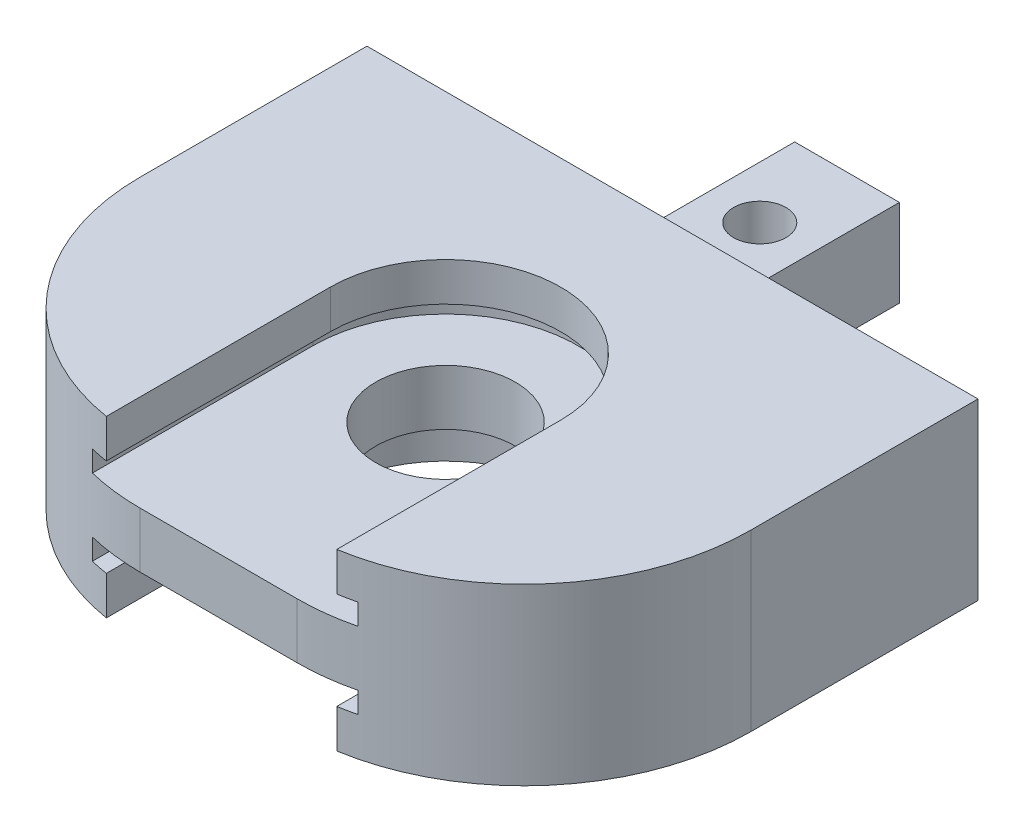
ISO-10303-21;
HEADER;
FILE_DESCRIPTION(('STEP AP214'),'2;1');
FILE_NAME('part.step','',(''),(''),'','','');
FILE_SCHEMA(('AUTOMOTIVE_DESIGN { 1 0 10303 214 1 1 1 1 }'));
ENDSEC;
DATA;
#1=APPLICATION_CONTEXT('core data for automotive mechanical design processes');
#2=APPLICATION_PROTOCOL_DEFINITION('international standard','automotive_design',2000,#1);
#3=PRODUCT_CONTEXT('',#1,'mechanical');
#4=PRODUCT('Part','Part','',(#3));
#5=PRODUCT_RELATED_PRODUCT_CATEGORY('part','',(#4));
#6=PRODUCT_DEFINITION_FORMATION('','',#4);
#7=PRODUCT_DEFINITION_CONTEXT('part definition',#1,'design');
#8=PRODUCT_DEFINITION('design','',#6,#7);
#9=PRODUCT_DEFINITION_SHAPE('','',#8);
#10=(LENGTH_UNIT() NAMED_UNIT(*) SI_UNIT(.MILLI.,.METRE.));
#11=(NAMED_UNIT(*) PLANE_ANGLE_UNIT() SI_UNIT($,.RADIAN.));
#12=(NAMED_UNIT(*) SI_UNIT($,.STERADIAN.) SOLID_ANGLE_UNIT());
#13=UNCERTAINTY_MEASURE_WITH_UNIT(LENGTH_MEASURE(1.E-05),#10,'distance_accuracy_value','');
#14=(GEOMETRIC_REPRESENTATION_CONTEXT(3) GLOBAL_UNCERTAINTY_ASSIGNED_CONTEXT((#13)) GLOBAL_UNIT_ASSIGNED_CONTEXT((#10,
#11,#12)) REPRESENTATION_CONTEXT('',''));
#15=CARTESIAN_POINT('',(0.,0.,0.));
#16=DIRECTION('',(0.,0.,1.));
#17=DIRECTION('',(1.,0.,0.));
#18=AXIS2_PLACEMENT_3D('',#15,#16,#17);
#19=CARTESIAN_POINT('',(33.,5.,36.));
#20=DIRECTION('',(0.,0.,-1.));
#21=DIRECTION('',(-1.,0.,0.));
#22=AXIS2_PLACEMENT_3D('',#19,#20,#21);
#23=PLANE('',#22);
#24=DIRECTION('',(0.,-1.,0.));
#25=VECTOR('',#24,1.);
#26=CARTESIAN_POINT('',(11.,5.,36.));
#27=LINE('',#26,#25);
#28=CARTESIAN_POINT('',(11.,4.0875,36.));
#29=VERTEX_POINT('',#28);
#30=CARTESIAN_POINT('',(11.,0.912499999999999,36.));
#31=VERTEX_POINT('',#30);
#32=EDGE_CURVE('E409',#29,#31,#27,.T.);
#33=ORIENTED_EDGE('',*,*,#32,.T.);
#34=DIRECTION('',(-1.,0.,0.));
#35=VECTOR('',#34,1.);
#36=CARTESIAN_POINT('',(23.1,0.912499999999999,36.));
#37=LINE('',#36,#35);
#38=CARTESIAN_POINT('',(20.,0.912499999999999,36.));
#39=VERTEX_POINT('',#38);
#40=EDGE_CURVE('E242',#39,#31,#37,.T.);
#41=ORIENTED_EDGE('',*,*,#40,.F.);
#42=DIRECTION('',(0.,-1.,0.));
#43=VECTOR('',#42,1.);
#44=CARTESIAN_POINT('',(20.,5.,36.));
#45=LINE('',#44,#43);
#46=CARTESIAN_POINT('',(20.,4.0875,36.));
#47=VERTEX_POINT('',#46);
#48=EDGE_CURVE('E412',#39,#47,#45,.F.);
#49=ORIENTED_EDGE('',*,*,#48,.T.);
#50=DIRECTION('',(-1.,0.,0.));
#51=VECTOR('',#50,1.);
#52=CARTESIAN_POINT('',(15.5,4.0875,36.));
#53=LINE('',#52,#51);
#54=EDGE_CURVE('E284',#47,#29,#53,.T.);
#55=ORIENTED_EDGE('',*,*,#54,.T.);
#56=EDGE_LOOP('',(#33,#41,#49,#55));
#57=FACE_BOUND('',#56,.T.);
#58=ADVANCED_FACE('F41',(#57),#23,.F.);
#59=CARTESIAN_POINT('',(-2.,7.5,-25.0891721190455));
#60=DIRECTION('',(0.,1.,0.));
#61=DIRECTION('',(0.,0.,1.));
#62=AXIS2_PLACEMENT_3D('',#59,#60,#61);
#63=PLANE('',#62);
#64=DIRECTION('',(0.,0.,1.));
#65=VECTOR('',#64,1.);
#66=CARTESIAN_POINT('',(8.9,7.5,23.));
#67=LINE('',#66,#65);
#68=CARTESIAN_POINT('',(8.9,7.5,23.));
#69=VERTEX_POINT('',#68);
#70=CARTESIAN_POINT('',(8.9,7.5,35.8292634239071));
#71=VERTEX_POINT('',#70);
#72=EDGE_CURVE('E57',#69,#71,#67,.T.);
#73=ORIENTED_EDGE('',*,*,#72,.F.);
#74=CARTESIAN_POINT('',(15.5,7.5,23.));
#75=DIRECTION('',(0.,1.,0.));
#76=DIRECTION('',(0.,0.,1.));
#77=AXIS2_PLACEMENT_3D('',#74,#75,#76);
#78=CIRCLE('',#77,6.6);
#79=CARTESIAN_POINT('',(22.1,7.5,23.));
#80=VERTEX_POINT('',#79);
#81=EDGE_CURVE('E271',#80,#69,#78,.T.);
#82=ORIENTED_EDGE('',*,*,#81,.F.);
#83=DIRECTION('',(0.,0.,1.));
#84=VECTOR('',#83,1.);
#85=CARTESIAN_POINT('',(22.1,7.5,23.));
#86=LINE('',#85,#84);
#87=CARTESIAN_POINT('',(22.1,7.5,35.8292634239071));
#88=VERTEX_POINT('',#87);
#89=EDGE_CURVE('E321',#80,#88,#86,.T.);
#90=ORIENTED_EDGE('',*,*,#89,.T.);
#91=CARTESIAN_POINT('',(20.,7.5,23.));
#92=DIRECTION('',(0.,1.,0.));
#93=DIRECTION('',(0.,0.,1.));
#94=AXIS2_PLACEMENT_3D('',#91,#92,#93);
#95=CIRCLE('',#94,13.);
#96=CARTESIAN_POINT('',(33.,7.5,23.));
#97=VERTEX_POINT('',#96);
#98=EDGE_CURVE('E418',#88,#97,#95,.T.);
#99=ORIENTED_EDGE('',*,*,#98,.T.);
#100=DIRECTION('',(0.,0.,1.));
#101=VECTOR('',#100,1.);
#102=CARTESIAN_POINT('',(33.,7.5,-25.0891721190455));
#103=LINE('',#102,#101);
#104=CARTESIAN_POINT('',(33.,7.5,10.));
#105=VERTEX_POINT('',#104);
#106=EDGE_CURVE('E343',#105,#97,#103,.T.);
#107=ORIENTED_EDGE('',*,*,#106,.F.);
#108=DIRECTION('',(1.,0.,0.));
#109=VECTOR('',#108,1.);
#110=CARTESIAN_POINT('',(-2.,7.5,10.));
#111=LINE('',#110,#109);
#112=CARTESIAN_POINT('',(-2.,7.5,10.));
#113=VERTEX_POINT('',#112);
#114=EDGE_CURVE('E344',#113,#105,#111,.T.);
#115=ORIENTED_EDGE('',*,*,#114,.F.);
#116=DIRECTION('',(0.,0.,1.));
#117=VECTOR('',#116,1.);
#118=CARTESIAN_POINT('',(-2.,7.5,-25.0891721190455));
#119=LINE('',#118,#117);
#120=CARTESIAN_POINT('',(-2.,7.5,23.));
#121=VERTEX_POINT('',#120);
#122=EDGE_CURVE('E349',#113,#121,#119,.T.);
#123=ORIENTED_EDGE('',*,*,#122,.T.);
#124=CARTESIAN_POINT('',(11.,7.5,23.));
#125=DIRECTION('',(0.,1.,0.));
#126=DIRECTION('',(0.,0.,1.));
#127=AXIS2_PLACEMENT_3D('',#124,#125,#126);
#128=CIRCLE('',#127,13.);
#129=EDGE_CURVE('E414',#121,#71,#128,.T.);
#130=ORIENTED_EDGE('',*,*,#129,.T.);
#131=EDGE_LOOP('',(#73,#82,#90,#99,#107,#115,#123,#130));
#132=FACE_BOUND('',#131,.T.);
#133=ADVANCED_FACE('F545',(#132),#63,.T.);
#134=CARTESIAN_POINT('',(20.,5.,23.));
#135=DIRECTION('',(0.,-1.,0.));
#136=DIRECTION('',(0.,0.,-1.));
#137=AXIS2_PLACEMENT_3D('',#134,#135,#136);
#138=CYLINDRICAL_SURFACE('',#137,13.);
#139=CARTESIAN_POINT('',(20.,0.912499999999999,23.));
#140=DIRECTION('',(0.,1.,0.));
#141=DIRECTION('',(0.,0.,1.));
#142=AXIS2_PLACEMENT_3D('',#139,#140,#141);
#143=CIRCLE('',#142,13.);
#144=CARTESIAN_POINT('',(23.1,0.912499999999999,35.6249752475005));
#145=VERTEX_POINT('',#144);
#146=EDGE_CURVE('E269',#145,#39,#143,.F.);
#147=ORIENTED_EDGE('',*,*,#146,.F.);
#148=DIRECTION('',(0.,-1.,0.));
#149=VECTOR('',#148,1.);
#150=CARTESIAN_POINT('',(23.1,5.,35.6249752475005));
#151=LINE('',#150,#149);
#152=CARTESIAN_POINT('',(23.1,-0.287500000000004,35.6249752475005));
#153=VERTEX_POINT('',#152);
#154=EDGE_CURVE('E11',#153,#145,#151,.F.);
#155=ORIENTED_EDGE('',*,*,#154,.F.);
#156=CARTESIAN_POINT('',(20.,-0.287499999999993,23.));
#157=DIRECTION('',(0.,-1.,0.));
#158=DIRECTION('',(1.,0.,0.));
#159=AXIS2_PLACEMENT_3D('',#156,#157,#158);
#160=CIRCLE('',#159,13.);
#161=CARTESIAN_POINT('',(22.1,-0.2875,35.8292634239071));
#162=VERTEX_POINT('',#161);
#163=EDGE_CURVE('E50',#162,#153,#160,.F.);
#164=ORIENTED_EDGE('',*,*,#163,.F.);
#165=DIRECTION('',(0.,-1.,0.));
#166=VECTOR('',#165,1.);
#167=CARTESIAN_POINT('',(22.1,5.,35.8292634239071));
#168=LINE('',#167,#166);
#169=CARTESIAN_POINT('',(22.1,-2.5,35.8292634239071));
#170=VERTEX_POINT('',#169);
#171=EDGE_CURVE('E257',#170,#162,#168,.F.);
#172=ORIENTED_EDGE('',*,*,#171,.F.);
#173=CARTESIAN_POINT('',(20.,-2.5,23.));
#174=DIRECTION('',(0.,-1.,0.));
#175=DIRECTION('',(0.,0.,-1.));
#176=AXIS2_PLACEMENT_3D('',#173,#174,#175);
#177=CIRCLE('',#176,13.);
#178=CARTESIAN_POINT('',(33.,-2.5,23.));
#179=VERTEX_POINT('',#178);
#180=EDGE_CURVE('E406',#179,#170,#177,.T.);
#181=ORIENTED_EDGE('',*,*,#180,.F.);
#182=DIRECTION('',(0.,-1.,0.));
#183=VECTOR('',#182,1.);
#184=CARTESIAN_POINT('',(33.,5.,23.));
#185=LINE('',#184,#183);
#186=EDGE_CURVE('E331',#97,#179,#185,.T.);
#187=ORIENTED_EDGE('',*,*,#186,.F.);
#188=ORIENTED_EDGE('',*,*,#98,.F.);
#189=DIRECTION('',(0.,-1.,0.));
#190=VECTOR('',#189,1.);
#191=CARTESIAN_POINT('',(22.1,5.,35.8292634239071));
#192=LINE('',#191,#190);
#193=CARTESIAN_POINT('',(22.1,5.2875,35.8292634239071));
#194=VERTEX_POINT('',#193);
#195=EDGE_CURVE('E439',#88,#194,#192,.T.);
#196=ORIENTED_EDGE('',*,*,#195,.T.);
#197=CARTESIAN_POINT('',(20.,5.28749999999999,23.));
#198=DIRECTION('',(0.,-1.,0.));
#199=DIRECTION('',(1.,0.,0.));
#200=AXIS2_PLACEMENT_3D('',#197,#198,#199);
#201=CIRCLE('',#200,13.);
#202=CARTESIAN_POINT('',(23.1,5.2875,35.6249752475005));
#203=VERTEX_POINT('',#202);
#204=EDGE_CURVE('E436',#194,#203,#201,.F.);
#205=ORIENTED_EDGE('',*,*,#204,.T.);
#206=DIRECTION('',(0.,-1.,0.));
#207=VECTOR('',#206,1.);
#208=CARTESIAN_POINT('',(23.1,5.,35.6249752475005));
#209=LINE('',#208,#207);
#210=CARTESIAN_POINT('',(23.1,4.0875,35.6249752475005));
#211=VERTEX_POINT('',#210);
#212=EDGE_CURVE('E433',#203,#211,#209,.T.);
#213=ORIENTED_EDGE('',*,*,#212,.T.);
#214=CARTESIAN_POINT('',(20.,4.0875,23.));
#215=DIRECTION('',(0.,1.,0.));
#216=DIRECTION('',(0.,0.,1.));
#217=AXIS2_PLACEMENT_3D('',#214,#215,#216);
#218=CIRCLE('',#217,13.);
#219=EDGE_CURVE('E324',#211,#47,#218,.F.);
#220=ORIENTED_EDGE('',*,*,#219,.T.);
#221=ORIENTED_EDGE('',*,*,#48,.F.);
#222=EDGE_LOOP('',(#147,#155,#164,#172,#181,#187,#188,#196,#205,#213,#220,#221));
#223=FACE_BOUND('',#222,.T.);
#224=ADVANCED_FACE('F469',(#223),#138,.T.);
#225=CARTESIAN_POINT('',(11.,5.,23.));
#226=DIRECTION('',(0.,-1.,0.));
#227=DIRECTION('',(0.,0.,-1.));
#228=AXIS2_PLACEMENT_3D('',#225,#226,#227);
#229=CYLINDRICAL_SURFACE('',#228,13.);
#230=DIRECTION('',(0.,-1.,0.));
#231=VECTOR('',#230,1.);
#232=CARTESIAN_POINT('',(8.9,5.,35.8292634239071));
#233=LINE('',#232,#231);
#234=CARTESIAN_POINT('',(8.9,-0.287500000000004,35.8292634239071));
#235=VERTEX_POINT('',#234);
#236=CARTESIAN_POINT('',(8.9,-2.5,35.8292634239071));
#237=VERTEX_POINT('',#236);
#238=EDGE_CURVE('E255',#235,#237,#233,.T.);
#239=ORIENTED_EDGE('',*,*,#238,.F.);
#240=CARTESIAN_POINT('',(11.,-0.287500000000004,23.));
#241=DIRECTION('',(0.,-1.,0.));
#242=DIRECTION('',(0.,0.,-1.));
#243=AXIS2_PLACEMENT_3D('',#240,#241,#242);
#244=CIRCLE('',#243,13.);
#245=CARTESIAN_POINT('',(7.9,-0.287500000000004,35.6249752475005));
#246=VERTEX_POINT('',#245);
#247=EDGE_CURVE('E446',#246,#235,#244,.F.);
#248=ORIENTED_EDGE('',*,*,#247,.F.);
#249=DIRECTION('',(0.,-1.,0.));
#250=VECTOR('',#249,1.);
#251=CARTESIAN_POINT('',(7.9,5.,35.6249752475005));
#252=LINE('',#251,#250);
#253=CARTESIAN_POINT('',(7.9,0.912499999999999,35.6249752475005));
#254=VERTEX_POINT('',#253);
#255=EDGE_CURVE('E444',#254,#246,#252,.T.);
#256=ORIENTED_EDGE('',*,*,#255,.F.);
#257=CARTESIAN_POINT('',(11.,0.912499999999999,23.));
#258=DIRECTION('',(0.,1.,0.));
#259=DIRECTION('',(0.,0.,1.));
#260=AXIS2_PLACEMENT_3D('',#257,#258,#259);
#261=CIRCLE('',#260,13.);
#262=EDGE_CURVE('E442',#31,#254,#261,.F.);
#263=ORIENTED_EDGE('',*,*,#262,.F.);
#264=ORIENTED_EDGE('',*,*,#32,.F.);
#265=CARTESIAN_POINT('',(11.,4.0875,23.));
#266=DIRECTION('',(0.,1.,0.));
#267=DIRECTION('',(0.,0.,1.));
#268=AXIS2_PLACEMENT_3D('',#265,#266,#267);
#269=CIRCLE('',#268,13.);
#270=CARTESIAN_POINT('',(7.9,4.0875,35.6249752475005));
#271=VERTEX_POINT('',#270);
#272=EDGE_CURVE('E430',#29,#271,#269,.F.);
#273=ORIENTED_EDGE('',*,*,#272,.T.);
#274=DIRECTION('',(0.,-1.,0.));
#275=VECTOR('',#274,1.);
#276=CARTESIAN_POINT('',(7.9,5.,35.6249752475005));
#277=LINE('',#276,#275);
#278=CARTESIAN_POINT('',(7.9,5.2875,35.6249752475005));
#279=VERTEX_POINT('',#278);
#280=EDGE_CURVE('E427',#271,#279,#277,.F.);
#281=ORIENTED_EDGE('',*,*,#280,.T.);
#282=CARTESIAN_POINT('',(11.,5.2875,23.));
#283=DIRECTION('',(0.,-1.,0.));
#284=DIRECTION('',(0.,0.,-1.));
#285=AXIS2_PLACEMENT_3D('',#282,#283,#284);
#286=CIRCLE('',#285,13.);
#287=CARTESIAN_POINT('',(8.9,5.2875,35.8292634239071));
#288=VERTEX_POINT('',#287);
#289=EDGE_CURVE('E424',#279,#288,#286,.F.);
#290=ORIENTED_EDGE('',*,*,#289,.T.);
#291=DIRECTION('',(0.,-1.,0.));
#292=VECTOR('',#291,1.);
#293=CARTESIAN_POINT('',(8.9,5.,35.8292634239071));
#294=LINE('',#293,#292);
#295=EDGE_CURVE('E422',#288,#71,#294,.F.);
#296=ORIENTED_EDGE('',*,*,#295,.T.);
#297=ORIENTED_EDGE('',*,*,#129,.F.);
#298=DIRECTION('',(0.,-1.,0.));
#299=VECTOR('',#298,1.);
#300=CARTESIAN_POINT('',(-2.,5.,23.));
#301=LINE('',#300,#299);
#302=CARTESIAN_POINT('',(-2.,-2.5,23.));
#303=VERTEX_POINT('',#302);
#304=EDGE_CURVE('E68',#303,#121,#301,.F.);
#305=ORIENTED_EDGE('',*,*,#304,.F.);
#306=CARTESIAN_POINT('',(11.,-2.5,23.));
#307=DIRECTION('',(0.,-1.,0.));
#308=DIRECTION('',(0.,0.,-1.));
#309=AXIS2_PLACEMENT_3D('',#306,#307,#308);
#310=CIRCLE('',#309,13.);
#311=EDGE_CURVE('E404',#237,#303,#310,.T.);
#312=ORIENTED_EDGE('',*,*,#311,.F.);
#313=EDGE_LOOP('',(#239,#248,#256,#263,#264,#273,#281,#290,#296,#297,#305,#312));
#314=FACE_BOUND('',#313,.T.);
#315=ADVANCED_FACE('F43',(#314),#229,.T.);
#316=CARTESIAN_POINT('',(0.,0.,0.));
#317=DIRECTION('',(0.,1.,0.));
#318=DIRECTION('',(0.,0.,1.));
#319=AXIS2_PLACEMENT_3D('',#316,#317,#318);
#320=PLANE('',#319);
#321=CARTESIAN_POINT('',(15.5,0.,5.));
#322=DIRECTION('',(0.,1.,0.));
#323=DIRECTION('',(0.,0.,1.));
#324=AXIS2_PLACEMENT_3D('',#321,#322,#323);
#325=CIRCLE('',#324,1.5);
#326=CARTESIAN_POINT('',(15.5,0.,6.5));
#327=VERTEX_POINT('',#326);
#328=EDGE_CURVE('E348',#327,#327,#325,.T.);
#329=ORIENTED_EDGE('',*,*,#328,.T.);
#330=EDGE_LOOP('',(#329));
#331=FACE_BOUND('',#330,.T.);
#332=DIRECTION('',(1.,0.,0.));
#333=VECTOR('',#332,1.);
#334=CARTESIAN_POINT('',(-2.,0.,10.));
#335=LINE('',#334,#333);
#336=CARTESIAN_POINT('',(12.5,0.,10.));
#337=VERTEX_POINT('',#336);
#338=CARTESIAN_POINT('',(18.5,0.,10.));
#339=VERTEX_POINT('',#338);
#340=EDGE_CURVE('E328',#337,#339,#335,.T.);
#341=ORIENTED_EDGE('',*,*,#340,.F.);
#342=DIRECTION('',(0.,0.,1.));
#343=VECTOR('',#342,1.);
#344=CARTESIAN_POINT('',(12.5,0.,10.));
#345=LINE('',#344,#343);
#346=CARTESIAN_POINT('',(12.5,0.,0.));
#347=VERTEX_POINT('',#346);
#348=EDGE_CURVE('E371',#347,#337,#345,.T.);
#349=ORIENTED_EDGE('',*,*,#348,.F.);
#350=DIRECTION('',(-1.,0.,0.));
#351=VECTOR('',#350,1.);
#352=CARTESIAN_POINT('',(12.5,0.,0.));
#353=LINE('',#352,#351);
#354=CARTESIAN_POINT('',(18.5,0.,0.));
#355=VERTEX_POINT('',#354);
#356=EDGE_CURVE('E379',#355,#347,#353,.T.);
#357=ORIENTED_EDGE('',*,*,#356,.F.);
#358=DIRECTION('',(0.,0.,-1.));
#359=VECTOR('',#358,1.);
#360=CARTESIAN_POINT('',(18.5,0.,0.));
#361=LINE('',#360,#359);
#362=EDGE_CURVE('E363',#339,#355,#361,.T.);
#363=ORIENTED_EDGE('',*,*,#362,.F.);
#364=EDGE_LOOP('',(#341,#349,#357,#363));
#365=FACE_BOUND('',#364,.T.);
#366=ADVANCED_FACE('F561',(#331,#365),#320,.F.);
#367=CARTESIAN_POINT('',(0.,5.,0.));
#368=DIRECTION('',(0.,1.,0.));
#369=DIRECTION('',(0.,0.,1.));
#370=AXIS2_PLACEMENT_3D('',#367,#368,#369);
#371=PLANE('',#370);
#372=DIRECTION('',(-1.,0.,0.));
#373=VECTOR('',#372,1.);
#374=CARTESIAN_POINT('',(33.,5.,10.));
#375=LINE('',#374,#373);
#376=CARTESIAN_POINT('',(18.5,5.,10.));
#377=VERTEX_POINT('',#376);
#378=CARTESIAN_POINT('',(12.5,5.,10.));
#379=VERTEX_POINT('',#378);
#380=EDGE_CURVE('E332',#377,#379,#375,.T.);
#381=ORIENTED_EDGE('',*,*,#380,.F.);
#382=DIRECTION('',(0.,0.,-1.));
#383=VECTOR('',#382,1.);
#384=CARTESIAN_POINT('',(18.5,5.,0.));
#385=LINE('',#384,#383);
#386=CARTESIAN_POINT('',(18.5,5.,0.));
#387=VERTEX_POINT('',#386);
#388=EDGE_CURVE('E367',#377,#387,#385,.T.);
#389=ORIENTED_EDGE('',*,*,#388,.T.);
#390=DIRECTION('',(-1.,0.,0.));
#391=VECTOR('',#390,1.);
#392=CARTESIAN_POINT('',(12.5,5.,0.));
#393=LINE('',#392,#391);
#394=CARTESIAN_POINT('',(12.5,5.,0.));
#395=VERTEX_POINT('',#394);
#396=EDGE_CURVE('E370',#387,#395,#393,.T.);
#397=ORIENTED_EDGE('',*,*,#396,.T.);
#398=DIRECTION('',(0.,0.,1.));
#399=VECTOR('',#398,1.);
#400=CARTESIAN_POINT('',(12.5,5.,10.));
#401=LINE('',#400,#399);
#402=EDGE_CURVE('E374',#395,#379,#401,.T.);
#403=ORIENTED_EDGE('',*,*,#402,.T.);
#404=EDGE_LOOP('',(#381,#389,#397,#403));
#405=FACE_BOUND('',#404,.T.);
#406=CARTESIAN_POINT('',(15.5,5.,5.));
#407=DIRECTION('',(0.,1.,0.));
#408=DIRECTION('',(0.,0.,1.));
#409=AXIS2_PLACEMENT_3D('',#406,#407,#408);
#410=CIRCLE('',#409,1.5);
#411=CARTESIAN_POINT('',(15.5,5.,6.5));
#412=VERTEX_POINT('',#411);
#413=EDGE_CURVE('E359',#412,#412,#410,.T.);
#414=ORIENTED_EDGE('',*,*,#413,.F.);
#415=EDGE_LOOP('',(#414));
#416=FACE_BOUND('',#415,.T.);
#417=ADVANCED_FACE('F556',(#405,#416),#371,.T.);
#418=CARTESIAN_POINT('',(-2.,5.,36.));
#419=DIRECTION('',(1.,0.,0.));
#420=DIRECTION('',(0.,0.,-1.));
#421=AXIS2_PLACEMENT_3D('',#418,#419,#420);
#422=PLANE('',#421);
#423=DIRECTION('',(0.,0.,1.));
#424=VECTOR('',#423,1.);
#425=CARTESIAN_POINT('',(-2.,-2.5,-25.0891721190455));
#426=LINE('',#425,#424);
#427=CARTESIAN_POINT('',(-2.,-2.5,10.));
#428=VERTEX_POINT('',#427);
#429=EDGE_CURVE('E327',#428,#303,#426,.T.);
#430=ORIENTED_EDGE('',*,*,#429,.T.);
#431=ORIENTED_EDGE('',*,*,#304,.T.);
#432=ORIENTED_EDGE('',*,*,#122,.F.);
#433=DIRECTION('',(0.,-1.,0.));
#434=VECTOR('',#433,1.);
#435=CARTESIAN_POINT('',(-2.,5.,10.));
#436=LINE('',#435,#434);
#437=EDGE_CURVE('E353',#113,#428,#436,.T.);
#438=ORIENTED_EDGE('',*,*,#437,.T.);
#439=EDGE_LOOP('',(#430,#431,#432,#438));
#440=FACE_BOUND('',#439,.T.);
#441=ADVANCED_FACE('F508',(#440),#422,.F.);
#442=CARTESIAN_POINT('',(33.,5.,36.));
#443=DIRECTION('',(-1.,0.,0.));
#444=DIRECTION('',(0.,0.,1.));
#445=AXIS2_PLACEMENT_3D('',#442,#443,#444);
#446=PLANE('',#445);
#447=ORIENTED_EDGE('',*,*,#106,.T.);
#448=ORIENTED_EDGE('',*,*,#186,.T.);
#449=DIRECTION('',(0.,0.,1.));
#450=VECTOR('',#449,1.);
#451=CARTESIAN_POINT('',(33.,-2.5,-25.0891721190455));
#452=LINE('',#451,#450);
#453=CARTESIAN_POINT('',(33.,-2.5,10.));
#454=VERTEX_POINT('',#453);
#455=EDGE_CURVE('E333',#454,#179,#452,.T.);
#456=ORIENTED_EDGE('',*,*,#455,.F.);
#457=DIRECTION('',(0.,-1.,0.));
#458=VECTOR('',#457,1.);
#459=CARTESIAN_POINT('',(33.,5.,10.));
#460=LINE('',#459,#458);
#461=EDGE_CURVE('E397',#105,#454,#460,.T.);
#462=ORIENTED_EDGE('',*,*,#461,.F.);
#463=EDGE_LOOP('',(#447,#448,#456,#462));
#464=FACE_BOUND('',#463,.T.);
#465=ADVANCED_FACE('F515',(#464),#446,.F.);
#466=CARTESIAN_POINT('',(18.5,5.,0.));
#467=DIRECTION('',(-1.,0.,0.));
#468=DIRECTION('',(0.,0.,1.));
#469=AXIS2_PLACEMENT_3D('',#466,#467,#468);
#470=PLANE('',#469);
#471=ORIENTED_EDGE('',*,*,#362,.T.);
#472=DIRECTION('',(0.,-1.,0.));
#473=VECTOR('',#472,1.);
#474=CARTESIAN_POINT('',(18.5,5.,0.));
#475=LINE('',#474,#473);
#476=EDGE_CURVE('E389',#387,#355,#475,.T.);
#477=ORIENTED_EDGE('',*,*,#476,.F.);
#478=ORIENTED_EDGE('',*,*,#388,.F.);
#479=DIRECTION('',(0.,-1.,0.));
#480=VECTOR('',#479,1.);
#481=CARTESIAN_POINT('',(18.5,5.,10.));
#482=LINE('',#481,#480);
#483=EDGE_CURVE('E393',#377,#339,#482,.T.);
#484=ORIENTED_EDGE('',*,*,#483,.T.);
#485=EDGE_LOOP('',(#471,#477,#478,#484));
#486=FACE_BOUND('',#485,.T.);
#487=ADVANCED_FACE('F584',(#486),#470,.F.);
#488=CARTESIAN_POINT('',(12.5,5.,0.));
#489=DIRECTION('',(0.,0.,1.));
#490=DIRECTION('',(1.,0.,0.));
#491=AXIS2_PLACEMENT_3D('',#488,#489,#490);
#492=PLANE('',#491);
#493=ORIENTED_EDGE('',*,*,#356,.T.);
#494=DIRECTION('',(0.,-1.,0.));
#495=VECTOR('',#494,1.);
#496=CARTESIAN_POINT('',(12.5,5.,0.));
#497=LINE('',#496,#495);
#498=EDGE_CURVE('E386',#395,#347,#497,.T.);
#499=ORIENTED_EDGE('',*,*,#498,.F.);
#500=ORIENTED_EDGE('',*,*,#396,.F.);
#501=ORIENTED_EDGE('',*,*,#476,.T.);
#502=EDGE_LOOP('',(#493,#499,#500,#501));
#503=FACE_BOUND('',#502,.T.);
#504=ADVANCED_FACE('F581',(#503),#492,.F.);
#505=CARTESIAN_POINT('',(12.5,5.,10.));
#506=DIRECTION('',(1.,0.,0.));
#507=DIRECTION('',(0.,0.,-1.));
#508=AXIS2_PLACEMENT_3D('',#505,#506,#507);
#509=PLANE('',#508);
#510=ORIENTED_EDGE('',*,*,#348,.T.);
#511=DIRECTION('',(0.,-1.,0.));
#512=VECTOR('',#511,1.);
#513=CARTESIAN_POINT('',(12.5,5.,10.));
#514=LINE('',#513,#512);
#515=EDGE_CURVE('E376',#379,#337,#514,.T.);
#516=ORIENTED_EDGE('',*,*,#515,.F.);
#517=ORIENTED_EDGE('',*,*,#402,.F.);
#518=ORIENTED_EDGE('',*,*,#498,.T.);
#519=EDGE_LOOP('',(#510,#516,#517,#518));
#520=FACE_BOUND('',#519,.T.);
#521=ADVANCED_FACE('F578',(#520),#509,.F.);
#522=CARTESIAN_POINT('',(6.,5.,10.));
#523=DIRECTION('',(0.,0.,1.));
#524=DIRECTION('',(1.,0.,0.));
#525=AXIS2_PLACEMENT_3D('',#522,#523,#524);
#526=PLANE('',#525);
#527=DIRECTION('',(-1.,0.,0.));
#528=VECTOR('',#527,1.);
#529=CARTESIAN_POINT('',(33.,-2.5,10.));
#530=LINE('',#529,#528);
#531=EDGE_CURVE('E337',#454,#428,#530,.T.);
#532=ORIENTED_EDGE('',*,*,#531,.T.);
#533=ORIENTED_EDGE('',*,*,#437,.F.);
#534=ORIENTED_EDGE('',*,*,#114,.T.);
#535=ORIENTED_EDGE('',*,*,#461,.T.);
#536=EDGE_LOOP('',(#532,#533,#534,#535));
#537=FACE_BOUND('',#536,.T.);
#538=ORIENTED_EDGE('',*,*,#515,.T.);
#539=ORIENTED_EDGE('',*,*,#340,.T.);
#540=ORIENTED_EDGE('',*,*,#483,.F.);
#541=ORIENTED_EDGE('',*,*,#380,.T.);
#542=EDGE_LOOP('',(#538,#539,#540,#541));
#543=FACE_BOUND('',#542,.T.);
#544=ADVANCED_FACE('F511',(#537,#543),#526,.F.);
#545=CARTESIAN_POINT('',(15.5,5.,5.));
#546=DIRECTION('',(0.,-1.,0.));
#547=DIRECTION('',(0.,0.,-1.));
#548=AXIS2_PLACEMENT_3D('',#545,#546,#547);
#549=CYLINDRICAL_SURFACE('',#548,1.5);
#550=ORIENTED_EDGE('',*,*,#413,.T.);
#551=EDGE_LOOP('',(#550));
#552=FACE_BOUND('',#551,.T.);
#553=ORIENTED_EDGE('',*,*,#328,.F.);
#554=EDGE_LOOP('',(#553));
#555=FACE_BOUND('',#554,.T.);
#556=ADVANCED_FACE('F577',(#552,#555),#549,.F.);
#557=CARTESIAN_POINT('',(33.,-2.5,-25.0891721190455));
#558=DIRECTION('',(0.,-1.,0.));
#559=DIRECTION('',(0.,0.,-1.));
#560=AXIS2_PLACEMENT_3D('',#557,#558,#559);
#561=PLANE('',#560);
#562=DIRECTION('',(0.,0.,1.));
#563=VECTOR('',#562,1.);
#564=CARTESIAN_POINT('',(22.1,-2.5,23.));
#565=LINE('',#564,#563);
#566=CARTESIAN_POINT('',(22.1,-2.5,23.));
#567=VERTEX_POINT('',#566);
#568=EDGE_CURVE('E251',#567,#170,#565,.T.);
#569=ORIENTED_EDGE('',*,*,#568,.F.);
#570=CARTESIAN_POINT('',(15.5,-2.5,23.));
#571=DIRECTION('',(0.,-1.,0.));
#572=DIRECTION('',(0.,0.,-1.));
#573=AXIS2_PLACEMENT_3D('',#570,#571,#572);
#574=CIRCLE('',#573,6.6);
#575=CARTESIAN_POINT('',(8.9,-2.5,23.));
#576=VERTEX_POINT('',#575);
#577=EDGE_CURVE('E233',#576,#567,#574,.T.);
#578=ORIENTED_EDGE('',*,*,#577,.F.);
#579=DIRECTION('',(0.,0.,1.));
#580=VECTOR('',#579,1.);
#581=CARTESIAN_POINT('',(8.9,-2.5,23.));
#582=LINE('',#581,#580);
#583=EDGE_CURVE('E248',#576,#237,#582,.T.);
#584=ORIENTED_EDGE('',*,*,#583,.T.);
#585=ORIENTED_EDGE('',*,*,#311,.T.);
#586=ORIENTED_EDGE('',*,*,#429,.F.);
#587=ORIENTED_EDGE('',*,*,#531,.F.);
#588=ORIENTED_EDGE('',*,*,#455,.T.);
#589=ORIENTED_EDGE('',*,*,#180,.T.);
#590=EDGE_LOOP('',(#569,#578,#584,#585,#586,#587,#588,#589));
#591=FACE_BOUND('',#590,.T.);
#592=ADVANCED_FACE('F247',(#591),#561,.T.);
#593=CARTESIAN_POINT('',(22.1,7.5,23.));
#594=DIRECTION('',(-1.,0.,0.));
#595=DIRECTION('',(0.,0.,1.));
#596=AXIS2_PLACEMENT_3D('',#593,#594,#595);
#597=PLANE('',#596);
#598=ORIENTED_EDGE('',*,*,#89,.F.);
#599=DIRECTION('',(0.,-1.,0.));
#600=VECTOR('',#599,1.);
#601=CARTESIAN_POINT('',(22.1,7.5,23.));
#602=LINE('',#601,#600);
#603=CARTESIAN_POINT('',(22.1,5.28749999999998,23.));
#604=VERTEX_POINT('',#603);
#605=EDGE_CURVE('E285',#80,#604,#602,.T.);
#606=ORIENTED_EDGE('',*,*,#605,.T.);
#607=DIRECTION('',(0.,0.,1.));
#608=VECTOR('',#607,1.);
#609=CARTESIAN_POINT('',(22.1,5.2875,23.));
#610=LINE('',#609,#608);
#611=EDGE_CURVE('E319',#604,#194,#610,.T.);
#612=ORIENTED_EDGE('',*,*,#611,.T.);
#613=ORIENTED_EDGE('',*,*,#195,.F.);
#614=EDGE_LOOP('',(#598,#606,#612,#613));
#615=FACE_BOUND('',#614,.T.);
#616=ADVANCED_FACE('F610',(#615),#597,.T.);
#617=CARTESIAN_POINT('',(22.1,5.2875,23.));
#618=DIRECTION('',(0.,-1.,0.));
#619=DIRECTION('',(1.,0.,0.));
#620=AXIS2_PLACEMENT_3D('',#617,#618,#619);
#621=PLANE('',#620);
#622=ORIENTED_EDGE('',*,*,#611,.F.);
#623=CARTESIAN_POINT('',(15.5,5.28749999999998,23.));
#624=DIRECTION('',(0.,-1.,0.));
#625=DIRECTION('',(1.,0.,0.));
#626=AXIS2_PLACEMENT_3D('',#623,#624,#625);
#627=CIRCLE('',#626,6.6);
#628=CARTESIAN_POINT('',(8.9,5.2875,23.));
#629=VERTEX_POINT('',#628);
#630=EDGE_CURVE('E274',#604,#629,#627,.F.);
#631=ORIENTED_EDGE('',*,*,#630,.T.);
#632=DIRECTION('',(0.,0.,1.));
#633=VECTOR('',#632,1.);
#634=CARTESIAN_POINT('',(8.9,5.2875,23.));
#635=LINE('',#634,#633);
#636=EDGE_CURVE('E302',#629,#288,#635,.T.);
#637=ORIENTED_EDGE('',*,*,#636,.T.);
#638=ORIENTED_EDGE('',*,*,#289,.F.);
#639=DIRECTION('',(0.,0.,1.));
#640=VECTOR('',#639,1.);
#641=CARTESIAN_POINT('',(7.9,5.2875,23.));
#642=LINE('',#641,#640);
#643=CARTESIAN_POINT('',(7.89999999999999,5.2875,23.));
#644=VERTEX_POINT('',#643);
#645=EDGE_CURVE('E305',#644,#279,#642,.T.);
#646=ORIENTED_EDGE('',*,*,#645,.F.);
#647=CARTESIAN_POINT('',(15.5,5.2875,23.));
#648=DIRECTION('',(0.,-1.,0.));
#649=DIRECTION('',(0.,0.,-1.));
#650=AXIS2_PLACEMENT_3D('',#647,#648,#649);
#651=CIRCLE('',#650,7.6);
#652=CARTESIAN_POINT('',(23.1,5.2875,23.));
#653=VERTEX_POINT('',#652);
#654=EDGE_CURVE('E281',#644,#653,#651,.T.);
#655=ORIENTED_EDGE('',*,*,#654,.T.);
#656=DIRECTION('',(0.,0.,1.));
#657=VECTOR('',#656,1.);
#658=CARTESIAN_POINT('',(23.1,5.2875,23.));
#659=LINE('',#658,#657);
#660=EDGE_CURVE('E316',#653,#203,#659,.T.);
#661=ORIENTED_EDGE('',*,*,#660,.T.);
#662=ORIENTED_EDGE('',*,*,#204,.F.);
#663=EDGE_LOOP('',(#622,#631,#637,#638,#646,#655,#661,#662));
#664=FACE_BOUND('',#663,.T.);
#665=ADVANCED_FACE('F615',(#664),#621,.T.);
#666=CARTESIAN_POINT('',(23.1,5.2875,23.));
#667=DIRECTION('',(-1.,0.,0.));
#668=DIRECTION('',(0.,0.,1.));
#669=AXIS2_PLACEMENT_3D('',#666,#667,#668);
#670=PLANE('',#669);
#671=ORIENTED_EDGE('',*,*,#660,.F.);
#672=DIRECTION('',(0.,-1.,0.));
#673=VECTOR('',#672,1.);
#674=CARTESIAN_POINT('',(23.1,5.2875,23.));
#675=LINE('',#674,#673);
#676=CARTESIAN_POINT('',(23.1,4.0875,23.));
#677=VERTEX_POINT('',#676);
#678=EDGE_CURVE('E288',#653,#677,#675,.T.);
#679=ORIENTED_EDGE('',*,*,#678,.T.);
#680=DIRECTION('',(0.,0.,1.));
#681=VECTOR('',#680,1.);
#682=CARTESIAN_POINT('',(23.1,4.0875,23.));
#683=LINE('',#682,#681);
#684=EDGE_CURVE('E313',#677,#211,#683,.T.);
#685=ORIENTED_EDGE('',*,*,#684,.T.);
#686=ORIENTED_EDGE('',*,*,#212,.F.);
#687=EDGE_LOOP('',(#671,#679,#685,#686));
#688=FACE_BOUND('',#687,.T.);
#689=ADVANCED_FACE('F619',(#688),#670,.T.);
#690=CARTESIAN_POINT('',(15.5,4.0875,23.));
#691=DIRECTION('',(0.,1.,0.));
#692=DIRECTION('',(0.,0.,1.));
#693=AXIS2_PLACEMENT_3D('',#690,#691,#692);
#694=PLANE('',#693);
#695=CARTESIAN_POINT('',(15.5,4.0875,23.));
#696=DIRECTION('',(0.,1.,0.));
#697=DIRECTION('',(0.,0.,1.));
#698=AXIS2_PLACEMENT_3D('',#695,#696,#697);
#699=CIRCLE('',#698,4.);
#700=CARTESIAN_POINT('',(15.5,4.0875,27.));
#701=VERTEX_POINT('',#700);
#702=EDGE_CURVE('E528',#701,#701,#699,.T.);
#703=ORIENTED_EDGE('',*,*,#702,.F.);
#704=EDGE_LOOP('',(#703));
#705=FACE_BOUND('',#704,.T.);
#706=ORIENTED_EDGE('',*,*,#684,.F.);
#707=CARTESIAN_POINT('',(15.5,4.0875,23.));
#708=DIRECTION('',(0.,1.,0.));
#709=DIRECTION('',(0.,0.,1.));
#710=AXIS2_PLACEMENT_3D('',#707,#708,#709);
#711=CIRCLE('',#710,7.6);
#712=CARTESIAN_POINT('',(7.89999999999999,4.0875,23.));
#713=VERTEX_POINT('',#712);
#714=EDGE_CURVE('E277',#677,#713,#711,.T.);
#715=ORIENTED_EDGE('',*,*,#714,.T.);
#716=DIRECTION('',(0.,0.,1.));
#717=VECTOR('',#716,1.);
#718=CARTESIAN_POINT('',(7.9,4.0875,23.));
#719=LINE('',#718,#717);
#720=EDGE_CURVE('E309',#713,#271,#719,.T.);
#721=ORIENTED_EDGE('',*,*,#720,.T.);
#722=ORIENTED_EDGE('',*,*,#272,.F.);
#723=ORIENTED_EDGE('',*,*,#54,.F.);
#724=ORIENTED_EDGE('',*,*,#219,.F.);
#725=EDGE_LOOP('',(#706,#715,#721,#722,#723,#724));
#726=FACE_BOUND('',#725,.T.);
#727=ADVANCED_FACE('F623',(#705,#726),#694,.T.);
#728=CARTESIAN_POINT('',(7.9,4.0875,23.));
#729=DIRECTION('',(1.,0.,0.));
#730=DIRECTION('',(0.,0.,-1.));
#731=AXIS2_PLACEMENT_3D('',#728,#729,#730);
#732=PLANE('',#731);
#733=ORIENTED_EDGE('',*,*,#720,.F.);
#734=DIRECTION('',(0.,1.,0.));
#735=VECTOR('',#734,1.);
#736=CARTESIAN_POINT('',(7.9,4.0875,23.));
#737=LINE('',#736,#735);
#738=EDGE_CURVE('E291',#713,#644,#737,.T.);
#739=ORIENTED_EDGE('',*,*,#738,.T.);
#740=ORIENTED_EDGE('',*,*,#645,.T.);
#741=ORIENTED_EDGE('',*,*,#280,.F.);
#742=EDGE_LOOP('',(#733,#739,#740,#741));
#743=FACE_BOUND('',#742,.T.);
#744=ADVANCED_FACE('F627',(#743),#732,.T.);
#745=CARTESIAN_POINT('',(8.9,5.2875,23.));
#746=DIRECTION('',(1.,0.,0.));
#747=DIRECTION('',(0.,0.,-1.));
#748=AXIS2_PLACEMENT_3D('',#745,#746,#747);
#749=PLANE('',#748);
#750=ORIENTED_EDGE('',*,*,#636,.F.);
#751=DIRECTION('',(0.,1.,0.));
#752=VECTOR('',#751,1.);
#753=CARTESIAN_POINT('',(8.9,5.2875,23.));
#754=LINE('',#753,#752);
#755=EDGE_CURVE('E295',#629,#69,#754,.T.);
#756=ORIENTED_EDGE('',*,*,#755,.T.);
#757=ORIENTED_EDGE('',*,*,#72,.T.);
#758=ORIENTED_EDGE('',*,*,#295,.F.);
#759=EDGE_LOOP('',(#750,#756,#757,#758));
#760=FACE_BOUND('',#759,.T.);
#761=ADVANCED_FACE('F631',(#760),#749,.T.);
#762=CARTESIAN_POINT('',(15.5,26.7835461480711,23.));
#763=DIRECTION('',(0.,-1.,0.));
#764=DIRECTION('',(0.,0.,-1.));
#765=AXIS2_PLACEMENT_3D('',#762,#763,#764);
#766=CYLINDRICAL_SURFACE('',#765,7.6);
#767=ORIENTED_EDGE('',*,*,#678,.F.);
#768=ORIENTED_EDGE('',*,*,#654,.F.);
#769=ORIENTED_EDGE('',*,*,#738,.F.);
#770=ORIENTED_EDGE('',*,*,#714,.F.);
#771=EDGE_LOOP('',(#767,#768,#769,#770));
#772=FACE_BOUND('',#771,.T.);
#773=ADVANCED_FACE('F635',(#772),#766,.F.);
#774=CARTESIAN_POINT('',(15.5,7.5,23.));
#775=DIRECTION('',(0.,-1.,0.));
#776=DIRECTION('',(0.,0.,-1.));
#777=AXIS2_PLACEMENT_3D('',#774,#775,#776);
#778=CYLINDRICAL_SURFACE('',#777,6.6);
#779=ORIENTED_EDGE('',*,*,#605,.F.);
#780=ORIENTED_EDGE('',*,*,#81,.T.);
#781=ORIENTED_EDGE('',*,*,#755,.F.);
#782=ORIENTED_EDGE('',*,*,#630,.F.);
#783=EDGE_LOOP('',(#779,#780,#781,#782));
#784=FACE_BOUND('',#783,.T.);
#785=ADVANCED_FACE('F638',(#784),#778,.F.);
#786=CARTESIAN_POINT('',(8.9,-0.287500000000004,23.));
#787=DIRECTION('',(-1.,0.,0.));
#788=DIRECTION('',(0.,0.,1.));
#789=AXIS2_PLACEMENT_3D('',#786,#787,#788);
#790=PLANE('',#789);
#791=ORIENTED_EDGE('',*,*,#238,.T.);
#792=ORIENTED_EDGE('',*,*,#583,.F.);
#793=DIRECTION('',(0.,-1.,0.));
#794=VECTOR('',#793,1.);
#795=CARTESIAN_POINT('',(8.9,-0.287500000000004,23.));
#796=LINE('',#795,#794);
#797=CARTESIAN_POINT('',(8.9,-0.287500000000004,23.));
#798=VERTEX_POINT('',#797);
#799=EDGE_CURVE('E230',#798,#576,#796,.T.);
#800=ORIENTED_EDGE('',*,*,#799,.F.);
#801=DIRECTION('',(0.,0.,1.));
#802=VECTOR('',#801,1.);
#803=CARTESIAN_POINT('',(8.9,-0.287500000000004,23.));
#804=LINE('',#803,#802);
#805=EDGE_CURVE('E258',#798,#235,#804,.T.);
#806=ORIENTED_EDGE('',*,*,#805,.T.);
#807=EDGE_LOOP('',(#791,#792,#800,#806));
#808=FACE_BOUND('',#807,.T.);
#809=ADVANCED_FACE('F253',(#808),#790,.F.);
#810=CARTESIAN_POINT('',(7.9,-0.287500000000004,23.));
#811=DIRECTION('',(0.,-1.,0.));
#812=DIRECTION('',(0.,0.,-1.));
#813=AXIS2_PLACEMENT_3D('',#810,#811,#812);
#814=PLANE('',#813);
#815=CARTESIAN_POINT('',(15.5,-0.287500000000004,23.));
#816=DIRECTION('',(0.,-1.,0.));
#817=DIRECTION('',(0.,0.,-1.));
#818=AXIS2_PLACEMENT_3D('',#815,#816,#817);
#819=CIRCLE('',#818,6.6);
#820=CARTESIAN_POINT('',(22.1,-0.2875,23.));
#821=VERTEX_POINT('',#820);
#822=EDGE_CURVE('E236',#821,#798,#819,.F.);
#823=ORIENTED_EDGE('',*,*,#822,.F.);
#824=DIRECTION('',(0.,0.,1.));
#825=VECTOR('',#824,1.);
#826=CARTESIAN_POINT('',(22.1,-0.2875,23.));
#827=LINE('',#826,#825);
#828=EDGE_CURVE('E457',#821,#162,#827,.T.);
#829=ORIENTED_EDGE('',*,*,#828,.T.);
#830=ORIENTED_EDGE('',*,*,#163,.T.);
#831=DIRECTION('',(0.,0.,1.));
#832=VECTOR('',#831,1.);
#833=CARTESIAN_POINT('',(23.1,-0.287500000000004,23.));
#834=LINE('',#833,#832);
#835=CARTESIAN_POINT('',(23.1,-0.287500000000003,23.));
#836=VERTEX_POINT('',#835);
#837=EDGE_CURVE('E454',#836,#153,#834,.T.);
#838=ORIENTED_EDGE('',*,*,#837,.F.);
#839=CARTESIAN_POINT('',(15.5,-0.287500000000003,23.));
#840=DIRECTION('',(0.,-1.,0.));
#841=DIRECTION('',(0.,0.,-1.));
#842=AXIS2_PLACEMENT_3D('',#839,#840,#841);
#843=CIRCLE('',#842,7.6);
#844=CARTESIAN_POINT('',(7.9,-0.287500000000004,23.));
#845=VERTEX_POINT('',#844);
#846=EDGE_CURVE('E480',#845,#836,#843,.T.);
#847=ORIENTED_EDGE('',*,*,#846,.F.);
#848=DIRECTION('',(0.,0.,1.));
#849=VECTOR('',#848,1.);
#850=CARTESIAN_POINT('',(7.9,-0.287500000000004,23.));
#851=LINE('',#850,#849);
#852=EDGE_CURVE('E264',#845,#246,#851,.T.);
#853=ORIENTED_EDGE('',*,*,#852,.T.);
#854=ORIENTED_EDGE('',*,*,#247,.T.);
#855=ORIENTED_EDGE('',*,*,#805,.F.);
#856=EDGE_LOOP('',(#823,#829,#830,#838,#847,#853,#854,#855));
#857=FACE_BOUND('',#856,.T.);
#858=ADVANCED_FACE('F453',(#857),#814,.F.);
#859=CARTESIAN_POINT('',(7.9,0.912499999999999,23.));
#860=DIRECTION('',(-1.,0.,0.));
#861=DIRECTION('',(0.,0.,1.));
#862=AXIS2_PLACEMENT_3D('',#859,#860,#861);
#863=PLANE('',#862);
#864=ORIENTED_EDGE('',*,*,#255,.T.);
#865=ORIENTED_EDGE('',*,*,#852,.F.);
#866=DIRECTION('',(0.,-1.,0.));
#867=VECTOR('',#866,1.);
#868=CARTESIAN_POINT('',(7.9,0.912499999999999,23.));
#869=LINE('',#868,#867);
#870=CARTESIAN_POINT('',(7.89999999999999,0.912499999999999,23.));
#871=VERTEX_POINT('',#870);
#872=EDGE_CURVE('E241',#871,#845,#869,.T.);
#873=ORIENTED_EDGE('',*,*,#872,.F.);
#874=DIRECTION('',(0.,0.,1.));
#875=VECTOR('',#874,1.);
#876=CARTESIAN_POINT('',(7.9,0.912499999999999,23.));
#877=LINE('',#876,#875);
#878=EDGE_CURVE('E492',#871,#254,#877,.T.);
#879=ORIENTED_EDGE('',*,*,#878,.T.);
#880=EDGE_LOOP('',(#864,#865,#873,#879));
#881=FACE_BOUND('',#880,.T.);
#882=ADVANCED_FACE('F647',(#881),#863,.F.);
#883=CARTESIAN_POINT('',(23.1,0.912499999999999,23.));
#884=DIRECTION('',(0.,1.,0.));
#885=DIRECTION('',(0.,0.,1.));
#886=AXIS2_PLACEMENT_3D('',#883,#884,#885);
#887=PLANE('',#886);
#888=CARTESIAN_POINT('',(15.5,0.912499999999999,23.));
#889=DIRECTION('',(0.,1.,0.));
#890=DIRECTION('',(0.,0.,1.));
#891=AXIS2_PLACEMENT_3D('',#888,#889,#890);
#892=CIRCLE('',#891,4.);
#893=CARTESIAN_POINT('',(15.5,0.912499999999999,27.));
#894=VERTEX_POINT('',#893);
#895=EDGE_CURVE('E45',#894,#894,#892,.T.);
#896=ORIENTED_EDGE('',*,*,#895,.T.);
#897=EDGE_LOOP('',(#896));
#898=FACE_BOUND('',#897,.T.);
#899=ORIENTED_EDGE('',*,*,#878,.F.);
#900=CARTESIAN_POINT('',(15.5,0.912499999999999,23.));
#901=DIRECTION('',(0.,-1.,0.));
#902=DIRECTION('',(0.,0.,-1.));
#903=AXIS2_PLACEMENT_3D('',#900,#901,#902);
#904=CIRCLE('',#903,7.6);
#905=CARTESIAN_POINT('',(23.1,0.912499999999999,23.));
#906=VERTEX_POINT('',#905);
#907=EDGE_CURVE('E483',#871,#906,#904,.T.);
#908=ORIENTED_EDGE('',*,*,#907,.T.);
#909=DIRECTION('',(0.,0.,1.));
#910=VECTOR('',#909,1.);
#911=CARTESIAN_POINT('',(23.1,0.912499999999999,23.));
#912=LINE('',#911,#910);
#913=EDGE_CURVE('E466',#906,#145,#912,.T.);
#914=ORIENTED_EDGE('',*,*,#913,.T.);
#915=ORIENTED_EDGE('',*,*,#146,.T.);
#916=ORIENTED_EDGE('',*,*,#40,.T.);
#917=ORIENTED_EDGE('',*,*,#262,.T.);
#918=EDGE_LOOP('',(#899,#908,#914,#915,#916,#917));
#919=FACE_BOUND('',#918,.T.);
#920=ADVANCED_FACE('F474',(#898,#919),#887,.F.);
#921=CARTESIAN_POINT('',(23.1,-0.287500000000004,23.));
#922=DIRECTION('',(1.,0.,0.));
#923=DIRECTION('',(0.,0.,-1.));
#924=AXIS2_PLACEMENT_3D('',#921,#922,#923);
#925=PLANE('',#924);
#926=ORIENTED_EDGE('',*,*,#154,.T.);
#927=ORIENTED_EDGE('',*,*,#913,.F.);
#928=DIRECTION('',(0.,1.,0.));
#929=VECTOR('',#928,1.);
#930=CARTESIAN_POINT('',(23.1,-0.287500000000004,23.));
#931=LINE('',#930,#929);
#932=EDGE_CURVE('E465',#836,#906,#931,.T.);
#933=ORIENTED_EDGE('',*,*,#932,.F.);
#934=ORIENTED_EDGE('',*,*,#837,.T.);
#935=EDGE_LOOP('',(#926,#927,#933,#934));
#936=FACE_BOUND('',#935,.T.);
#937=ADVANCED_FACE('F462',(#936),#925,.F.);
#938=CARTESIAN_POINT('',(22.1,-2.5,23.));
#939=DIRECTION('',(1.,0.,0.));
#940=DIRECTION('',(0.,0.,-1.));
#941=AXIS2_PLACEMENT_3D('',#938,#939,#940);
#942=PLANE('',#941);
#943=ORIENTED_EDGE('',*,*,#171,.T.);
#944=ORIENTED_EDGE('',*,*,#828,.F.);
#945=DIRECTION('',(0.,1.,0.));
#946=VECTOR('',#945,1.);
#947=CARTESIAN_POINT('',(22.1,-2.5,23.));
#948=LINE('',#947,#946);
#949=EDGE_CURVE('E487',#567,#821,#948,.T.);
#950=ORIENTED_EDGE('',*,*,#949,.F.);
#951=ORIENTED_EDGE('',*,*,#568,.T.);
#952=EDGE_LOOP('',(#943,#944,#950,#951));
#953=FACE_BOUND('',#952,.T.);
#954=ADVANCED_FACE('F520',(#953),#942,.F.);
#955=CARTESIAN_POINT('',(15.5,-21.7835461480711,23.));
#956=DIRECTION('',(0.,1.,0.));
#957=DIRECTION('',(0.,0.,1.));
#958=AXIS2_PLACEMENT_3D('',#955,#956,#957);
#959=CYLINDRICAL_SURFACE('',#958,7.6);
#960=ORIENTED_EDGE('',*,*,#872,.T.);
#961=ORIENTED_EDGE('',*,*,#846,.T.);
#962=ORIENTED_EDGE('',*,*,#932,.T.);
#963=ORIENTED_EDGE('',*,*,#907,.F.);
#964=EDGE_LOOP('',(#960,#961,#962,#963));
#965=FACE_BOUND('',#964,.T.);
#966=ADVANCED_FACE('F542',(#965),#959,.F.);
#967=CARTESIAN_POINT('',(15.5,-2.5,23.));
#968=DIRECTION('',(0.,1.,0.));
#969=DIRECTION('',(0.,0.,1.));
#970=AXIS2_PLACEMENT_3D('',#967,#968,#969);
#971=CYLINDRICAL_SURFACE('',#970,6.6);
#972=ORIENTED_EDGE('',*,*,#799,.T.);
#973=ORIENTED_EDGE('',*,*,#577,.T.);
#974=ORIENTED_EDGE('',*,*,#949,.T.);
#975=ORIENTED_EDGE('',*,*,#822,.T.);
#976=EDGE_LOOP('',(#972,#973,#974,#975));
#977=FACE_BOUND('',#976,.T.);
#978=ADVANCED_FACE('F232',(#977),#971,.F.);
#979=CARTESIAN_POINT('',(15.5,-2.5,23.));
#980=DIRECTION('',(0.,1.,0.));
#981=DIRECTION('',(0.,0.,1.));
#982=AXIS2_PLACEMENT_3D('',#979,#980,#981);
#983=CYLINDRICAL_SURFACE('',#982,4.);
#984=ORIENTED_EDGE('',*,*,#702,.T.);
#985=EDGE_LOOP('',(#984));
#986=FACE_BOUND('',#985,.T.);
#987=ORIENTED_EDGE('',*,*,#895,.F.);
#988=EDGE_LOOP('',(#987));
#989=FACE_BOUND('',#988,.T.);
#990=ADVANCED_FACE('F536',(#986,#989),#983,.F.);
#991=CLOSED_SHELL('',(#58,#133,#224,#315,#366,#417,#441,#465,#487,#504,#521,#544,#556,#592,#616,
#665,#689,#727,#744,#761,#773,#785,#809,#858,#882,#920,#937,#954,#966,#978,#990));
#992=MANIFOLD_SOLID_BREP('B2',#991);
#993=ADVANCED_BREP_SHAPE_REPRESENTATION('',(#18,#992),#14);
#994=SHAPE_DEFINITION_REPRESENTATION(#9,#993);
ENDSEC;
END-ISO-10303-21;
